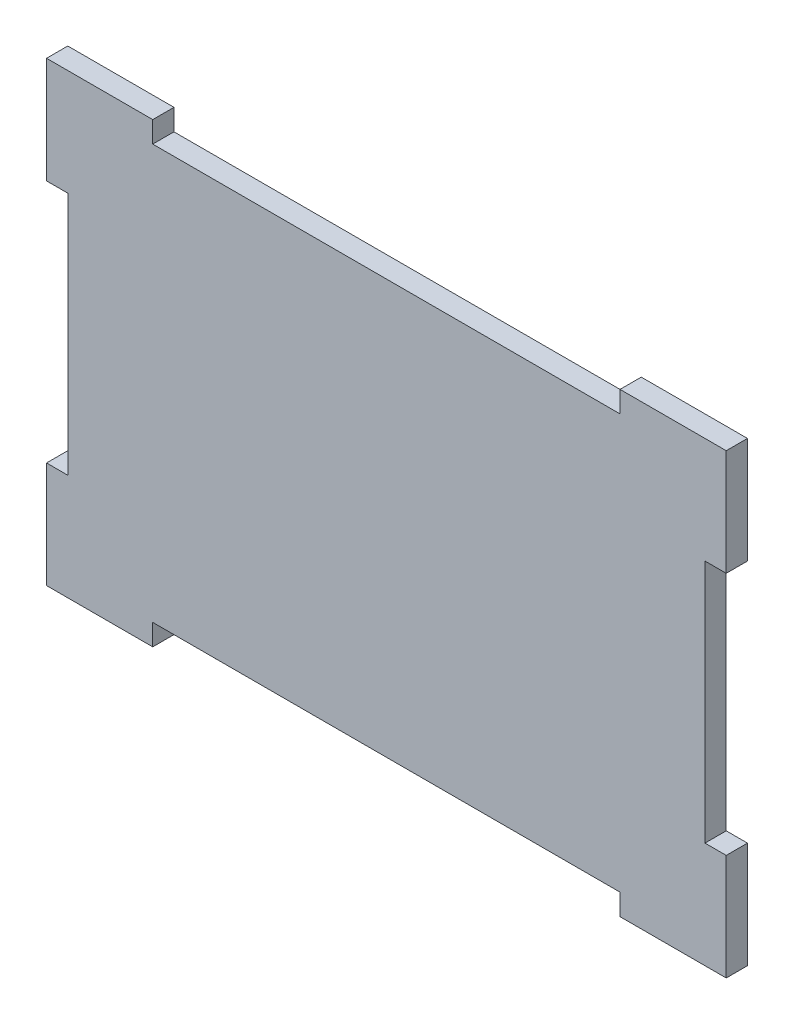
ISO-10303-21;
HEADER;
FILE_DESCRIPTION(('STEP AP214'),'2;1');
FILE_NAME('part.step','',(''),(''),'','','');
FILE_SCHEMA(('AUTOMOTIVE_DESIGN { 1 0 10303 214 1 1 1 1 }'));
ENDSEC;
DATA;
#1=APPLICATION_CONTEXT('core data for automotive mechanical design processes');
#2=APPLICATION_PROTOCOL_DEFINITION('international standard','automotive_design',2000,#1);
#3=PRODUCT_CONTEXT('',#1,'mechanical');
#4=PRODUCT('Part','Part','',(#3));
#5=PRODUCT_RELATED_PRODUCT_CATEGORY('part','',(#4));
#6=PRODUCT_DEFINITION_FORMATION('','',#4);
#7=PRODUCT_DEFINITION_CONTEXT('part definition',#1,'design');
#8=PRODUCT_DEFINITION('design','',#6,#7);
#9=PRODUCT_DEFINITION_SHAPE('','',#8);
#10=(LENGTH_UNIT() NAMED_UNIT(*) SI_UNIT(.MILLI.,.METRE.));
#11=(NAMED_UNIT(*) PLANE_ANGLE_UNIT() SI_UNIT($,.RADIAN.));
#12=(NAMED_UNIT(*) SI_UNIT($,.STERADIAN.) SOLID_ANGLE_UNIT());
#13=UNCERTAINTY_MEASURE_WITH_UNIT(LENGTH_MEASURE(1.E-05),#10,'distance_accuracy_value','');
#14=(GEOMETRIC_REPRESENTATION_CONTEXT(3) GLOBAL_UNCERTAINTY_ASSIGNED_CONTEXT((#13)) GLOBAL_UNIT_ASSIGNED_CONTEXT((#10,
#11,#12)) REPRESENTATION_CONTEXT('',''));
#15=CARTESIAN_POINT('',(0.,0.,0.));
#16=DIRECTION('',(0.,0.,1.));
#17=DIRECTION('',(1.,0.,0.));
#18=AXIS2_PLACEMENT_3D('',#15,#16,#17);
#19=CARTESIAN_POINT('',(20.,0.,4.));
#20=DIRECTION('',(0.,1.,0.));
#21=DIRECTION('',(-1.,0.,0.));
#22=AXIS2_PLACEMENT_3D('',#19,#20,#21);
#23=PLANE('',#22);
#24=DIRECTION('',(1.,0.,0.));
#25=VECTOR('',#24,1.);
#26=CARTESIAN_POINT('',(20.,0.,0.));
#27=LINE('',#26,#25);
#28=CARTESIAN_POINT('',(0.,0.,0.));
#29=VERTEX_POINT('',#28);
#30=CARTESIAN_POINT('',(20.,0.,0.));
#31=VERTEX_POINT('',#30);
#32=EDGE_CURVE('E200',#29,#31,#27,.T.);
#33=ORIENTED_EDGE('',*,*,#32,.T.);
#34=DIRECTION('',(0.,0.,-1.));
#35=VECTOR('',#34,1.);
#36=CARTESIAN_POINT('',(20.,0.,4.));
#37=LINE('',#36,#35);
#38=CARTESIAN_POINT('',(20.,0.,4.));
#39=VERTEX_POINT('',#38);
#40=EDGE_CURVE('E11',#39,#31,#37,.T.);
#41=ORIENTED_EDGE('',*,*,#40,.F.);
#42=DIRECTION('',(1.,0.,0.));
#43=VECTOR('',#42,1.);
#44=CARTESIAN_POINT('',(20.,0.,4.));
#45=LINE('',#44,#43);
#46=CARTESIAN_POINT('',(0.,0.,4.));
#47=VERTEX_POINT('',#46);
#48=EDGE_CURVE('E238',#47,#39,#45,.T.);
#49=ORIENTED_EDGE('',*,*,#48,.F.);
#50=DIRECTION('',(0.,0.,-1.));
#51=VECTOR('',#50,1.);
#52=CARTESIAN_POINT('',(0.,0.,4.));
#53=LINE('',#52,#51);
#54=EDGE_CURVE('E196',#47,#29,#53,.T.);
#55=ORIENTED_EDGE('',*,*,#54,.T.);
#56=EDGE_LOOP('',(#33,#41,#49,#55));
#57=FACE_BOUND('',#56,.T.);
#58=ADVANCED_FACE('F32',(#57),#23,.F.);
#59=CARTESIAN_POINT('',(20.,4.00000000000002,4.));
#60=DIRECTION('',(-1.,0.,0.));
#61=DIRECTION('',(0.,-1.,0.));
#62=AXIS2_PLACEMENT_3D('',#59,#60,#61);
#63=PLANE('',#62);
#64=DIRECTION('',(0.,1.,0.));
#65=VECTOR('',#64,1.);
#66=CARTESIAN_POINT('',(20.,4.00000000000002,0.));
#67=LINE('',#66,#65);
#68=CARTESIAN_POINT('',(20.,4.00000000000002,0.));
#69=VERTEX_POINT('',#68);
#70=EDGE_CURVE('E203',#31,#69,#67,.T.);
#71=ORIENTED_EDGE('',*,*,#70,.T.);
#72=DIRECTION('',(0.,0.,-1.));
#73=VECTOR('',#72,1.);
#74=CARTESIAN_POINT('',(20.,4.00000000000002,4.));
#75=LINE('',#74,#73);
#76=CARTESIAN_POINT('',(20.,4.00000000000002,4.));
#77=VERTEX_POINT('',#76);
#78=EDGE_CURVE('E40',#77,#69,#75,.T.);
#79=ORIENTED_EDGE('',*,*,#78,.F.);
#80=DIRECTION('',(0.,1.,0.));
#81=VECTOR('',#80,1.);
#82=CARTESIAN_POINT('',(20.,4.00000000000002,4.));
#83=LINE('',#82,#81);
#84=EDGE_CURVE('E127',#39,#77,#83,.T.);
#85=ORIENTED_EDGE('',*,*,#84,.F.);
#86=ORIENTED_EDGE('',*,*,#40,.T.);
#87=EDGE_LOOP('',(#71,#79,#85,#86));
#88=FACE_BOUND('',#87,.T.);
#89=ADVANCED_FACE('F356',(#88),#63,.F.);
#90=CARTESIAN_POINT('',(108.,4.00000000000004,4.));
#91=DIRECTION('',(0.,1.,0.));
#92=DIRECTION('',(-1.,0.,0.));
#93=AXIS2_PLACEMENT_3D('',#90,#91,#92);
#94=PLANE('',#93);
#95=DIRECTION('',(1.,0.,0.));
#96=VECTOR('',#95,1.);
#97=CARTESIAN_POINT('',(108.,4.00000000000004,0.));
#98=LINE('',#97,#96);
#99=CARTESIAN_POINT('',(108.,4.00000000000004,0.));
#100=VERTEX_POINT('',#99);
#101=EDGE_CURVE('E205',#69,#100,#98,.T.);
#102=ORIENTED_EDGE('',*,*,#101,.T.);
#103=DIRECTION('',(0.,0.,-1.));
#104=VECTOR('',#103,1.);
#105=CARTESIAN_POINT('',(108.,4.00000000000004,4.));
#106=LINE('',#105,#104);
#107=CARTESIAN_POINT('',(108.,4.00000000000004,4.));
#108=VERTEX_POINT('',#107);
#109=EDGE_CURVE('E281',#108,#100,#106,.T.);
#110=ORIENTED_EDGE('',*,*,#109,.F.);
#111=DIRECTION('',(1.,0.,0.));
#112=VECTOR('',#111,1.);
#113=CARTESIAN_POINT('',(108.,4.00000000000004,4.));
#114=LINE('',#113,#112);
#115=EDGE_CURVE('E289',#77,#108,#114,.T.);
#116=ORIENTED_EDGE('',*,*,#115,.F.);
#117=ORIENTED_EDGE('',*,*,#78,.T.);
#118=EDGE_LOOP('',(#102,#110,#116,#117));
#119=FACE_BOUND('',#118,.T.);
#120=ADVANCED_FACE('F287',(#119),#94,.F.);
#121=CARTESIAN_POINT('',(108.,0.,4.));
#122=DIRECTION('',(1.,0.,0.));
#123=DIRECTION('',(0.,0.,-1.));
#124=AXIS2_PLACEMENT_3D('',#121,#122,#123);
#125=PLANE('',#124);
#126=DIRECTION('',(0.,-1.,0.));
#127=VECTOR('',#126,1.);
#128=CARTESIAN_POINT('',(108.,0.,0.));
#129=LINE('',#128,#127);
#130=CARTESIAN_POINT('',(108.,0.,0.));
#131=VERTEX_POINT('',#130);
#132=EDGE_CURVE('E207',#100,#131,#129,.T.);
#133=ORIENTED_EDGE('',*,*,#132,.T.);
#134=DIRECTION('',(0.,0.,-1.));
#135=VECTOR('',#134,1.);
#136=CARTESIAN_POINT('',(108.,0.,4.));
#137=LINE('',#136,#135);
#138=CARTESIAN_POINT('',(108.,0.,4.));
#139=VERTEX_POINT('',#138);
#140=EDGE_CURVE('E278',#139,#131,#137,.T.);
#141=ORIENTED_EDGE('',*,*,#140,.F.);
#142=DIRECTION('',(0.,-1.,0.));
#143=VECTOR('',#142,1.);
#144=CARTESIAN_POINT('',(108.,0.,4.));
#145=LINE('',#144,#143);
#146=EDGE_CURVE('E307',#108,#139,#145,.T.);
#147=ORIENTED_EDGE('',*,*,#146,.F.);
#148=ORIENTED_EDGE('',*,*,#109,.T.);
#149=EDGE_LOOP('',(#133,#141,#147,#148));
#150=FACE_BOUND('',#149,.T.);
#151=ADVANCED_FACE('F298',(#150),#125,.F.);
#152=CARTESIAN_POINT('',(128.,0.,4.));
#153=DIRECTION('',(0.,1.,0.));
#154=DIRECTION('',(-1.,0.,0.));
#155=AXIS2_PLACEMENT_3D('',#152,#153,#154);
#156=PLANE('',#155);
#157=DIRECTION('',(1.,0.,0.));
#158=VECTOR('',#157,1.);
#159=CARTESIAN_POINT('',(128.,0.,0.));
#160=LINE('',#159,#158);
#161=CARTESIAN_POINT('',(128.,0.,0.));
#162=VERTEX_POINT('',#161);
#163=EDGE_CURVE('E209',#131,#162,#160,.T.);
#164=ORIENTED_EDGE('',*,*,#163,.T.);
#165=DIRECTION('',(0.,0.,-1.));
#166=VECTOR('',#165,1.);
#167=CARTESIAN_POINT('',(128.,0.,4.));
#168=LINE('',#167,#166);
#169=CARTESIAN_POINT('',(128.,0.,4.));
#170=VERTEX_POINT('',#169);
#171=EDGE_CURVE('E275',#170,#162,#168,.T.);
#172=ORIENTED_EDGE('',*,*,#171,.F.);
#173=DIRECTION('',(1.,0.,0.));
#174=VECTOR('',#173,1.);
#175=CARTESIAN_POINT('',(128.,0.,4.));
#176=LINE('',#175,#174);
#177=EDGE_CURVE('E304',#139,#170,#176,.T.);
#178=ORIENTED_EDGE('',*,*,#177,.F.);
#179=ORIENTED_EDGE('',*,*,#140,.T.);
#180=EDGE_LOOP('',(#164,#172,#178,#179));
#181=FACE_BOUND('',#180,.T.);
#182=ADVANCED_FACE('F302',(#181),#156,.F.);
#183=CARTESIAN_POINT('',(128.,20.0000000000001,4.));
#184=DIRECTION('',(-1.,0.,0.));
#185=DIRECTION('',(0.,0.,1.));
#186=AXIS2_PLACEMENT_3D('',#183,#184,#185);
#187=PLANE('',#186);
#188=DIRECTION('',(0.,1.,0.));
#189=VECTOR('',#188,1.);
#190=CARTESIAN_POINT('',(128.,20.0000000000001,0.));
#191=LINE('',#190,#189);
#192=CARTESIAN_POINT('',(128.,20.0000000000001,0.));
#193=VERTEX_POINT('',#192);
#194=EDGE_CURVE('E211',#162,#193,#191,.T.);
#195=ORIENTED_EDGE('',*,*,#194,.T.);
#196=DIRECTION('',(0.,0.,-1.));
#197=VECTOR('',#196,1.);
#198=CARTESIAN_POINT('',(128.,20.0000000000001,4.));
#199=LINE('',#198,#197);
#200=CARTESIAN_POINT('',(128.,20.0000000000001,4.));
#201=VERTEX_POINT('',#200);
#202=EDGE_CURVE('E272',#201,#193,#199,.T.);
#203=ORIENTED_EDGE('',*,*,#202,.F.);
#204=DIRECTION('',(0.,1.,0.));
#205=VECTOR('',#204,1.);
#206=CARTESIAN_POINT('',(128.,20.0000000000001,4.));
#207=LINE('',#206,#205);
#208=EDGE_CURVE('E306',#170,#201,#207,.T.);
#209=ORIENTED_EDGE('',*,*,#208,.F.);
#210=ORIENTED_EDGE('',*,*,#171,.T.);
#211=EDGE_LOOP('',(#195,#203,#209,#210));
#212=FACE_BOUND('',#211,.T.);
#213=ADVANCED_FACE('F369',(#212),#187,.F.);
#214=CARTESIAN_POINT('',(124.,20.0000000000001,4.));
#215=DIRECTION('',(0.,-1.,0.));
#216=DIRECTION('',(0.,0.,-1.));
#217=AXIS2_PLACEMENT_3D('',#214,#215,#216);
#218=PLANE('',#217);
#219=DIRECTION('',(-1.,0.,0.));
#220=VECTOR('',#219,1.);
#221=CARTESIAN_POINT('',(124.,20.0000000000001,0.));
#222=LINE('',#221,#220);
#223=CARTESIAN_POINT('',(124.,20.0000000000001,0.));
#224=VERTEX_POINT('',#223);
#225=EDGE_CURVE('E213',#193,#224,#222,.T.);
#226=ORIENTED_EDGE('',*,*,#225,.T.);
#227=DIRECTION('',(0.,0.,-1.));
#228=VECTOR('',#227,1.);
#229=CARTESIAN_POINT('',(124.,20.0000000000001,4.));
#230=LINE('',#229,#228);
#231=CARTESIAN_POINT('',(124.,20.0000000000001,4.));
#232=VERTEX_POINT('',#231);
#233=EDGE_CURVE('E269',#232,#224,#230,.T.);
#234=ORIENTED_EDGE('',*,*,#233,.F.);
#235=DIRECTION('',(-1.,0.,0.));
#236=VECTOR('',#235,1.);
#237=CARTESIAN_POINT('',(124.,20.0000000000001,4.));
#238=LINE('',#237,#236);
#239=EDGE_CURVE('E309',#201,#232,#238,.T.);
#240=ORIENTED_EDGE('',*,*,#239,.F.);
#241=ORIENTED_EDGE('',*,*,#202,.T.);
#242=EDGE_LOOP('',(#226,#234,#240,#241));
#243=FACE_BOUND('',#242,.T.);
#244=ADVANCED_FACE('F372',(#243),#218,.F.);
#245=CARTESIAN_POINT('',(124.,66.,4.));
#246=DIRECTION('',(-1.,0.,0.));
#247=DIRECTION('',(0.,-1.,0.));
#248=AXIS2_PLACEMENT_3D('',#245,#246,#247);
#249=PLANE('',#248);
#250=DIRECTION('',(0.,1.,0.));
#251=VECTOR('',#250,1.);
#252=CARTESIAN_POINT('',(124.,66.,0.));
#253=LINE('',#252,#251);
#254=CARTESIAN_POINT('',(124.,66.,0.));
#255=VERTEX_POINT('',#254);
#256=EDGE_CURVE('E215',#224,#255,#253,.T.);
#257=ORIENTED_EDGE('',*,*,#256,.T.);
#258=DIRECTION('',(0.,0.,-1.));
#259=VECTOR('',#258,1.);
#260=CARTESIAN_POINT('',(124.,66.,4.));
#261=LINE('',#260,#259);
#262=CARTESIAN_POINT('',(124.,66.,4.));
#263=VERTEX_POINT('',#262);
#264=EDGE_CURVE('E266',#263,#255,#261,.T.);
#265=ORIENTED_EDGE('',*,*,#264,.F.);
#266=DIRECTION('',(0.,1.,0.));
#267=VECTOR('',#266,1.);
#268=CARTESIAN_POINT('',(124.,66.,4.));
#269=LINE('',#268,#267);
#270=EDGE_CURVE('E315',#232,#263,#269,.T.);
#271=ORIENTED_EDGE('',*,*,#270,.F.);
#272=ORIENTED_EDGE('',*,*,#233,.T.);
#273=EDGE_LOOP('',(#257,#265,#271,#272));
#274=FACE_BOUND('',#273,.T.);
#275=ADVANCED_FACE('F376',(#274),#249,.F.);
#276=CARTESIAN_POINT('',(128.,66.,4.));
#277=DIRECTION('',(0.,1.,0.));
#278=DIRECTION('',(0.,0.,1.));
#279=AXIS2_PLACEMENT_3D('',#276,#277,#278);
#280=PLANE('',#279);
#281=DIRECTION('',(1.,0.,0.));
#282=VECTOR('',#281,1.);
#283=CARTESIAN_POINT('',(128.,66.,0.));
#284=LINE('',#283,#282);
#285=CARTESIAN_POINT('',(128.,66.,0.));
#286=VERTEX_POINT('',#285);
#287=EDGE_CURVE('E217',#255,#286,#284,.T.);
#288=ORIENTED_EDGE('',*,*,#287,.T.);
#289=DIRECTION('',(0.,0.,-1.));
#290=VECTOR('',#289,1.);
#291=CARTESIAN_POINT('',(128.,66.,4.));
#292=LINE('',#291,#290);
#293=CARTESIAN_POINT('',(128.,66.,4.));
#294=VERTEX_POINT('',#293);
#295=EDGE_CURVE('E263',#294,#286,#292,.T.);
#296=ORIENTED_EDGE('',*,*,#295,.F.);
#297=DIRECTION('',(1.,0.,0.));
#298=VECTOR('',#297,1.);
#299=CARTESIAN_POINT('',(128.,66.,4.));
#300=LINE('',#299,#298);
#301=EDGE_CURVE('E317',#263,#294,#300,.T.);
#302=ORIENTED_EDGE('',*,*,#301,.F.);
#303=ORIENTED_EDGE('',*,*,#264,.T.);
#304=EDGE_LOOP('',(#288,#296,#302,#303));
#305=FACE_BOUND('',#304,.T.);
#306=ADVANCED_FACE('F380',(#305),#280,.F.);
#307=CARTESIAN_POINT('',(128.,86.,4.));
#308=DIRECTION('',(-1.,0.,0.));
#309=DIRECTION('',(0.,0.,1.));
#310=AXIS2_PLACEMENT_3D('',#307,#308,#309);
#311=PLANE('',#310);
#312=DIRECTION('',(0.,1.,0.));
#313=VECTOR('',#312,1.);
#314=CARTESIAN_POINT('',(128.,86.,0.));
#315=LINE('',#314,#313);
#316=CARTESIAN_POINT('',(128.,86.,0.));
#317=VERTEX_POINT('',#316);
#318=EDGE_CURVE('E219',#286,#317,#315,.T.);
#319=ORIENTED_EDGE('',*,*,#318,.T.);
#320=DIRECTION('',(0.,0.,-1.));
#321=VECTOR('',#320,1.);
#322=CARTESIAN_POINT('',(128.,86.,4.));
#323=LINE('',#322,#321);
#324=CARTESIAN_POINT('',(128.,86.,4.));
#325=VERTEX_POINT('',#324);
#326=EDGE_CURVE('E260',#325,#317,#323,.T.);
#327=ORIENTED_EDGE('',*,*,#326,.F.);
#328=DIRECTION('',(0.,1.,0.));
#329=VECTOR('',#328,1.);
#330=CARTESIAN_POINT('',(128.,86.,4.));
#331=LINE('',#330,#329);
#332=EDGE_CURVE('E319',#294,#325,#331,.T.);
#333=ORIENTED_EDGE('',*,*,#332,.F.);
#334=ORIENTED_EDGE('',*,*,#295,.T.);
#335=EDGE_LOOP('',(#319,#327,#333,#334));
#336=FACE_BOUND('',#335,.T.);
#337=ADVANCED_FACE('F384',(#336),#311,.F.);
#338=CARTESIAN_POINT('',(108.,86.,4.));
#339=DIRECTION('',(0.,-1.,0.));
#340=DIRECTION('',(0.,0.,-1.));
#341=AXIS2_PLACEMENT_3D('',#338,#339,#340);
#342=PLANE('',#341);
#343=DIRECTION('',(-1.,0.,0.));
#344=VECTOR('',#343,1.);
#345=CARTESIAN_POINT('',(108.,86.,0.));
#346=LINE('',#345,#344);
#347=CARTESIAN_POINT('',(108.,86.,0.));
#348=VERTEX_POINT('',#347);
#349=EDGE_CURVE('E221',#317,#348,#346,.T.);
#350=ORIENTED_EDGE('',*,*,#349,.T.);
#351=DIRECTION('',(0.,0.,-1.));
#352=VECTOR('',#351,1.);
#353=CARTESIAN_POINT('',(108.,86.,4.));
#354=LINE('',#353,#352);
#355=CARTESIAN_POINT('',(108.,86.,4.));
#356=VERTEX_POINT('',#355);
#357=EDGE_CURVE('E257',#356,#348,#354,.T.);
#358=ORIENTED_EDGE('',*,*,#357,.F.);
#359=DIRECTION('',(-1.,0.,0.));
#360=VECTOR('',#359,1.);
#361=CARTESIAN_POINT('',(108.,86.,4.));
#362=LINE('',#361,#360);
#363=EDGE_CURVE('E321',#325,#356,#362,.T.);
#364=ORIENTED_EDGE('',*,*,#363,.F.);
#365=ORIENTED_EDGE('',*,*,#326,.T.);
#366=EDGE_LOOP('',(#350,#358,#364,#365));
#367=FACE_BOUND('',#366,.T.);
#368=ADVANCED_FACE('F388',(#367),#342,.F.);
#369=CARTESIAN_POINT('',(108.,82.,4.));
#370=DIRECTION('',(1.,0.,0.));
#371=DIRECTION('',(0.,1.,0.));
#372=AXIS2_PLACEMENT_3D('',#369,#370,#371);
#373=PLANE('',#372);
#374=DIRECTION('',(0.,-1.,0.));
#375=VECTOR('',#374,1.);
#376=CARTESIAN_POINT('',(108.,82.,0.));
#377=LINE('',#376,#375);
#378=CARTESIAN_POINT('',(108.,82.,0.));
#379=VERTEX_POINT('',#378);
#380=EDGE_CURVE('E223',#348,#379,#377,.T.);
#381=ORIENTED_EDGE('',*,*,#380,.T.);
#382=DIRECTION('',(0.,0.,-1.));
#383=VECTOR('',#382,1.);
#384=CARTESIAN_POINT('',(108.,82.,4.));
#385=LINE('',#384,#383);
#386=CARTESIAN_POINT('',(108.,82.,4.));
#387=VERTEX_POINT('',#386);
#388=EDGE_CURVE('E254',#387,#379,#385,.T.);
#389=ORIENTED_EDGE('',*,*,#388,.F.);
#390=DIRECTION('',(0.,-1.,0.));
#391=VECTOR('',#390,1.);
#392=CARTESIAN_POINT('',(108.,82.,4.));
#393=LINE('',#392,#391);
#394=EDGE_CURVE('E323',#356,#387,#393,.T.);
#395=ORIENTED_EDGE('',*,*,#394,.F.);
#396=ORIENTED_EDGE('',*,*,#357,.T.);
#397=EDGE_LOOP('',(#381,#389,#395,#396));
#398=FACE_BOUND('',#397,.T.);
#399=ADVANCED_FACE('F392',(#398),#373,.F.);
#400=CARTESIAN_POINT('',(20.,82.,4.));
#401=DIRECTION('',(0.,-1.,0.));
#402=DIRECTION('',(0.,0.,-1.));
#403=AXIS2_PLACEMENT_3D('',#400,#401,#402);
#404=PLANE('',#403);
#405=DIRECTION('',(-1.,0.,0.));
#406=VECTOR('',#405,1.);
#407=CARTESIAN_POINT('',(20.,82.,0.));
#408=LINE('',#407,#406);
#409=CARTESIAN_POINT('',(20.,82.,0.));
#410=VERTEX_POINT('',#409);
#411=EDGE_CURVE('E225',#379,#410,#408,.T.);
#412=ORIENTED_EDGE('',*,*,#411,.T.);
#413=DIRECTION('',(0.,0.,-1.));
#414=VECTOR('',#413,1.);
#415=CARTESIAN_POINT('',(20.,82.,4.));
#416=LINE('',#415,#414);
#417=CARTESIAN_POINT('',(20.,82.,4.));
#418=VERTEX_POINT('',#417);
#419=EDGE_CURVE('E251',#418,#410,#416,.T.);
#420=ORIENTED_EDGE('',*,*,#419,.F.);
#421=DIRECTION('',(-1.,0.,0.));
#422=VECTOR('',#421,1.);
#423=CARTESIAN_POINT('',(20.,82.,4.));
#424=LINE('',#423,#422);
#425=EDGE_CURVE('E325',#387,#418,#424,.T.);
#426=ORIENTED_EDGE('',*,*,#425,.F.);
#427=ORIENTED_EDGE('',*,*,#388,.T.);
#428=EDGE_LOOP('',(#412,#420,#426,#427));
#429=FACE_BOUND('',#428,.T.);
#430=ADVANCED_FACE('F396',(#429),#404,.F.);
#431=CARTESIAN_POINT('',(20.,86.,4.));
#432=DIRECTION('',(-1.,0.,0.));
#433=DIRECTION('',(0.,0.,1.));
#434=AXIS2_PLACEMENT_3D('',#431,#432,#433);
#435=PLANE('',#434);
#436=DIRECTION('',(0.,1.,0.));
#437=VECTOR('',#436,1.);
#438=CARTESIAN_POINT('',(20.,86.,0.));
#439=LINE('',#438,#437);
#440=CARTESIAN_POINT('',(20.,86.,0.));
#441=VERTEX_POINT('',#440);
#442=EDGE_CURVE('E227',#410,#441,#439,.T.);
#443=ORIENTED_EDGE('',*,*,#442,.T.);
#444=DIRECTION('',(0.,0.,-1.));
#445=VECTOR('',#444,1.);
#446=CARTESIAN_POINT('',(20.,86.,4.));
#447=LINE('',#446,#445);
#448=CARTESIAN_POINT('',(20.,86.,4.));
#449=VERTEX_POINT('',#448);
#450=EDGE_CURVE('E248',#449,#441,#447,.T.);
#451=ORIENTED_EDGE('',*,*,#450,.F.);
#452=DIRECTION('',(0.,1.,0.));
#453=VECTOR('',#452,1.);
#454=CARTESIAN_POINT('',(20.,86.,4.));
#455=LINE('',#454,#453);
#456=EDGE_CURVE('E327',#418,#449,#455,.T.);
#457=ORIENTED_EDGE('',*,*,#456,.F.);
#458=ORIENTED_EDGE('',*,*,#419,.T.);
#459=EDGE_LOOP('',(#443,#451,#457,#458));
#460=FACE_BOUND('',#459,.T.);
#461=ADVANCED_FACE('F400',(#460),#435,.F.);
#462=CARTESIAN_POINT('',(0.,86.,4.));
#463=DIRECTION('',(0.,-1.,0.));
#464=DIRECTION('',(0.,0.,-1.));
#465=AXIS2_PLACEMENT_3D('',#462,#463,#464);
#466=PLANE('',#465);
#467=DIRECTION('',(-1.,0.,0.));
#468=VECTOR('',#467,1.);
#469=CARTESIAN_POINT('',(0.,86.,0.));
#470=LINE('',#469,#468);
#471=CARTESIAN_POINT('',(0.,86.,0.));
#472=VERTEX_POINT('',#471);
#473=EDGE_CURVE('E229',#441,#472,#470,.T.);
#474=ORIENTED_EDGE('',*,*,#473,.T.);
#475=DIRECTION('',(0.,0.,-1.));
#476=VECTOR('',#475,1.);
#477=CARTESIAN_POINT('',(0.,86.,4.));
#478=LINE('',#477,#476);
#479=CARTESIAN_POINT('',(0.,86.,4.));
#480=VERTEX_POINT('',#479);
#481=EDGE_CURVE('E245',#480,#472,#478,.T.);
#482=ORIENTED_EDGE('',*,*,#481,.F.);
#483=DIRECTION('',(-1.,0.,0.));
#484=VECTOR('',#483,1.);
#485=CARTESIAN_POINT('',(0.,86.,4.));
#486=LINE('',#485,#484);
#487=EDGE_CURVE('E329',#449,#480,#486,.T.);
#488=ORIENTED_EDGE('',*,*,#487,.F.);
#489=ORIENTED_EDGE('',*,*,#450,.T.);
#490=EDGE_LOOP('',(#474,#482,#488,#489));
#491=FACE_BOUND('',#490,.T.);
#492=ADVANCED_FACE('F404',(#491),#466,.F.);
#493=CARTESIAN_POINT('',(0.,66.,4.));
#494=DIRECTION('',(1.,0.,0.));
#495=DIRECTION('',(0.,0.,-1.));
#496=AXIS2_PLACEMENT_3D('',#493,#494,#495);
#497=PLANE('',#496);
#498=DIRECTION('',(0.,-1.,0.));
#499=VECTOR('',#498,1.);
#500=CARTESIAN_POINT('',(0.,66.,0.));
#501=LINE('',#500,#499);
#502=CARTESIAN_POINT('',(0.,66.,0.));
#503=VERTEX_POINT('',#502);
#504=EDGE_CURVE('E231',#472,#503,#501,.T.);
#505=ORIENTED_EDGE('',*,*,#504,.T.);
#506=DIRECTION('',(0.,0.,-1.));
#507=VECTOR('',#506,1.);
#508=CARTESIAN_POINT('',(0.,66.,4.));
#509=LINE('',#508,#507);
#510=CARTESIAN_POINT('',(0.,66.,4.));
#511=VERTEX_POINT('',#510);
#512=EDGE_CURVE('E242',#511,#503,#509,.T.);
#513=ORIENTED_EDGE('',*,*,#512,.F.);
#514=DIRECTION('',(0.,-1.,0.));
#515=VECTOR('',#514,1.);
#516=CARTESIAN_POINT('',(0.,66.,4.));
#517=LINE('',#516,#515);
#518=EDGE_CURVE('E331',#480,#511,#517,.T.);
#519=ORIENTED_EDGE('',*,*,#518,.F.);
#520=ORIENTED_EDGE('',*,*,#481,.T.);
#521=EDGE_LOOP('',(#505,#513,#519,#520));
#522=FACE_BOUND('',#521,.T.);
#523=ADVANCED_FACE('F337',(#522),#497,.F.);
#524=CARTESIAN_POINT('',(0.,66.,4.));
#525=DIRECTION('',(0.,1.,0.));
#526=DIRECTION('',(0.,0.,1.));
#527=AXIS2_PLACEMENT_3D('',#524,#525,#526);
#528=PLANE('',#527);
#529=DIRECTION('',(1.,0.,0.));
#530=VECTOR('',#529,1.);
#531=CARTESIAN_POINT('',(0.,66.,0.));
#532=LINE('',#531,#530);
#533=CARTESIAN_POINT('',(3.99999999999999,66.,0.));
#534=VERTEX_POINT('',#533);
#535=EDGE_CURVE('E233',#503,#534,#532,.T.);
#536=ORIENTED_EDGE('',*,*,#535,.T.);
#537=DIRECTION('',(0.,0.,-1.));
#538=VECTOR('',#537,1.);
#539=CARTESIAN_POINT('',(3.99999999999999,66.,4.));
#540=LINE('',#539,#538);
#541=CARTESIAN_POINT('',(3.99999999999999,66.,4.));
#542=VERTEX_POINT('',#541);
#543=EDGE_CURVE('E191',#542,#534,#540,.T.);
#544=ORIENTED_EDGE('',*,*,#543,.F.);
#545=DIRECTION('',(1.,0.,0.));
#546=VECTOR('',#545,1.);
#547=CARTESIAN_POINT('',(0.,66.,4.));
#548=LINE('',#547,#546);
#549=EDGE_CURVE('E182',#511,#542,#548,.T.);
#550=ORIENTED_EDGE('',*,*,#549,.F.);
#551=ORIENTED_EDGE('',*,*,#512,.T.);
#552=EDGE_LOOP('',(#536,#544,#550,#551));
#553=FACE_BOUND('',#552,.T.);
#554=ADVANCED_FACE('F341',(#553),#528,.F.);
#555=CARTESIAN_POINT('',(3.99999999999999,66.,4.));
#556=DIRECTION('',(1.,0.,0.));
#557=DIRECTION('',(0.,1.,0.));
#558=AXIS2_PLACEMENT_3D('',#555,#556,#557);
#559=PLANE('',#558);
#560=DIRECTION('',(0.,-1.,0.));
#561=VECTOR('',#560,1.);
#562=CARTESIAN_POINT('',(3.99999999999999,66.,0.));
#563=LINE('',#562,#561);
#564=CARTESIAN_POINT('',(4.,20.,0.));
#565=VERTEX_POINT('',#564);
#566=EDGE_CURVE('E190',#534,#565,#563,.T.);
#567=ORIENTED_EDGE('',*,*,#566,.T.);
#568=DIRECTION('',(0.,0.,-1.));
#569=VECTOR('',#568,1.);
#570=CARTESIAN_POINT('',(4.,20.,4.));
#571=LINE('',#570,#569);
#572=CARTESIAN_POINT('',(4.,20.,4.));
#573=VERTEX_POINT('',#572);
#574=EDGE_CURVE('E187',#573,#565,#571,.T.);
#575=ORIENTED_EDGE('',*,*,#574,.F.);
#576=DIRECTION('',(0.,-1.,0.));
#577=VECTOR('',#576,1.);
#578=CARTESIAN_POINT('',(3.99999999999999,66.,4.));
#579=LINE('',#578,#577);
#580=EDGE_CURVE('E176',#542,#573,#579,.T.);
#581=ORIENTED_EDGE('',*,*,#580,.F.);
#582=ORIENTED_EDGE('',*,*,#543,.T.);
#583=EDGE_LOOP('',(#567,#575,#581,#582));
#584=FACE_BOUND('',#583,.T.);
#585=ADVANCED_FACE('F188',(#584),#559,.F.);
#586=CARTESIAN_POINT('',(4.,20.,4.));
#587=DIRECTION('',(0.,-1.,0.));
#588=DIRECTION('',(0.,0.,-1.));
#589=AXIS2_PLACEMENT_3D('',#586,#587,#588);
#590=PLANE('',#589);
#591=DIRECTION('',(-1.,0.,0.));
#592=VECTOR('',#591,1.);
#593=CARTESIAN_POINT('',(4.,20.,0.));
#594=LINE('',#593,#592);
#595=CARTESIAN_POINT('',(0.,20.,0.));
#596=VERTEX_POINT('',#595);
#597=EDGE_CURVE('E113',#565,#596,#594,.T.);
#598=ORIENTED_EDGE('',*,*,#597,.T.);
#599=DIRECTION('',(0.,0.,-1.));
#600=VECTOR('',#599,1.);
#601=CARTESIAN_POINT('',(0.,20.,4.));
#602=LINE('',#601,#600);
#603=CARTESIAN_POINT('',(0.,20.,4.));
#604=VERTEX_POINT('',#603);
#605=EDGE_CURVE('E192',#604,#596,#602,.T.);
#606=ORIENTED_EDGE('',*,*,#605,.F.);
#607=DIRECTION('',(-1.,0.,0.));
#608=VECTOR('',#607,1.);
#609=CARTESIAN_POINT('',(4.,20.,4.));
#610=LINE('',#609,#608);
#611=EDGE_CURVE('E180',#573,#604,#610,.T.);
#612=ORIENTED_EDGE('',*,*,#611,.F.);
#613=ORIENTED_EDGE('',*,*,#574,.T.);
#614=EDGE_LOOP('',(#598,#606,#612,#613));
#615=FACE_BOUND('',#614,.T.);
#616=ADVANCED_FACE('F194',(#615),#590,.F.);
#617=CARTESIAN_POINT('',(0.,0.,4.));
#618=DIRECTION('',(1.,0.,0.));
#619=DIRECTION('',(0.,1.,0.));
#620=AXIS2_PLACEMENT_3D('',#617,#618,#619);
#621=PLANE('',#620);
#622=DIRECTION('',(0.,-1.,0.));
#623=VECTOR('',#622,1.);
#624=CARTESIAN_POINT('',(0.,0.,0.));
#625=LINE('',#624,#623);
#626=EDGE_CURVE('E119',#596,#29,#625,.T.);
#627=ORIENTED_EDGE('',*,*,#626,.T.);
#628=ORIENTED_EDGE('',*,*,#54,.F.);
#629=DIRECTION('',(0.,-1.,0.));
#630=VECTOR('',#629,1.);
#631=CARTESIAN_POINT('',(0.,0.,4.));
#632=LINE('',#631,#630);
#633=EDGE_CURVE('E48',#604,#47,#632,.T.);
#634=ORIENTED_EDGE('',*,*,#633,.F.);
#635=ORIENTED_EDGE('',*,*,#605,.T.);
#636=EDGE_LOOP('',(#627,#628,#634,#635));
#637=FACE_BOUND('',#636,.T.);
#638=ADVANCED_FACE('F345',(#637),#621,.F.);
#639=CARTESIAN_POINT('',(0.,0.,4.));
#640=DIRECTION('',(0.,0.,-1.));
#641=DIRECTION('',(-1.,0.,0.));
#642=AXIS2_PLACEMENT_3D('',#639,#640,#641);
#643=PLANE('',#642);
#644=ORIENTED_EDGE('',*,*,#48,.T.);
#645=ORIENTED_EDGE('',*,*,#84,.T.);
#646=ORIENTED_EDGE('',*,*,#115,.T.);
#647=ORIENTED_EDGE('',*,*,#146,.T.);
#648=ORIENTED_EDGE('',*,*,#177,.T.);
#649=ORIENTED_EDGE('',*,*,#208,.T.);
#650=ORIENTED_EDGE('',*,*,#239,.T.);
#651=ORIENTED_EDGE('',*,*,#270,.T.);
#652=ORIENTED_EDGE('',*,*,#301,.T.);
#653=ORIENTED_EDGE('',*,*,#332,.T.);
#654=ORIENTED_EDGE('',*,*,#363,.T.);
#655=ORIENTED_EDGE('',*,*,#394,.T.);
#656=ORIENTED_EDGE('',*,*,#425,.T.);
#657=ORIENTED_EDGE('',*,*,#456,.T.);
#658=ORIENTED_EDGE('',*,*,#487,.T.);
#659=ORIENTED_EDGE('',*,*,#518,.T.);
#660=ORIENTED_EDGE('',*,*,#549,.T.);
#661=ORIENTED_EDGE('',*,*,#580,.T.);
#662=ORIENTED_EDGE('',*,*,#611,.T.);
#663=ORIENTED_EDGE('',*,*,#633,.T.);
#664=EDGE_LOOP('',(#644,#645,#646,#647,#648,#649,#650,#651,#652,#653,#654,#655,#656,#657,#658,
#659,#660,#661,#662,#663));
#665=FACE_BOUND('',#664,.T.);
#666=ADVANCED_FACE('F178',(#665),#643,.F.);
#667=CARTESIAN_POINT('',(0.,0.,0.));
#668=DIRECTION('',(0.,0.,-1.));
#669=DIRECTION('',(-1.,0.,0.));
#670=AXIS2_PLACEMENT_3D('',#667,#668,#669);
#671=PLANE('',#670);
#672=ORIENTED_EDGE('',*,*,#32,.F.);
#673=ORIENTED_EDGE('',*,*,#626,.F.);
#674=ORIENTED_EDGE('',*,*,#597,.F.);
#675=ORIENTED_EDGE('',*,*,#566,.F.);
#676=ORIENTED_EDGE('',*,*,#535,.F.);
#677=ORIENTED_EDGE('',*,*,#504,.F.);
#678=ORIENTED_EDGE('',*,*,#473,.F.);
#679=ORIENTED_EDGE('',*,*,#442,.F.);
#680=ORIENTED_EDGE('',*,*,#411,.F.);
#681=ORIENTED_EDGE('',*,*,#380,.F.);
#682=ORIENTED_EDGE('',*,*,#349,.F.);
#683=ORIENTED_EDGE('',*,*,#318,.F.);
#684=ORIENTED_EDGE('',*,*,#287,.F.);
#685=ORIENTED_EDGE('',*,*,#256,.F.);
#686=ORIENTED_EDGE('',*,*,#225,.F.);
#687=ORIENTED_EDGE('',*,*,#194,.F.);
#688=ORIENTED_EDGE('',*,*,#163,.F.);
#689=ORIENTED_EDGE('',*,*,#132,.F.);
#690=ORIENTED_EDGE('',*,*,#101,.F.);
#691=ORIENTED_EDGE('',*,*,#70,.F.);
#692=EDGE_LOOP('',(#672,#673,#674,#675,#676,#677,#678,#679,#680,#681,#682,#683,#684,#685,#686,
#687,#688,#689,#690,#691));
#693=FACE_BOUND('',#692,.T.);
#694=ADVANCED_FACE('F293',(#693),#671,.T.);
#695=CLOSED_SHELL('',(#58,#89,#120,#151,#182,#213,#244,#275,#306,#337,#368,#399,#430,#461,#492,
#523,#554,#585,#616,#638,#666,#694));
#696=MANIFOLD_SOLID_BREP('B2',#695);
#697=ADVANCED_BREP_SHAPE_REPRESENTATION('',(#18,#696),#14);
#698=SHAPE_DEFINITION_REPRESENTATION(#9,#697);
ENDSEC;
END-ISO-10303-21;
